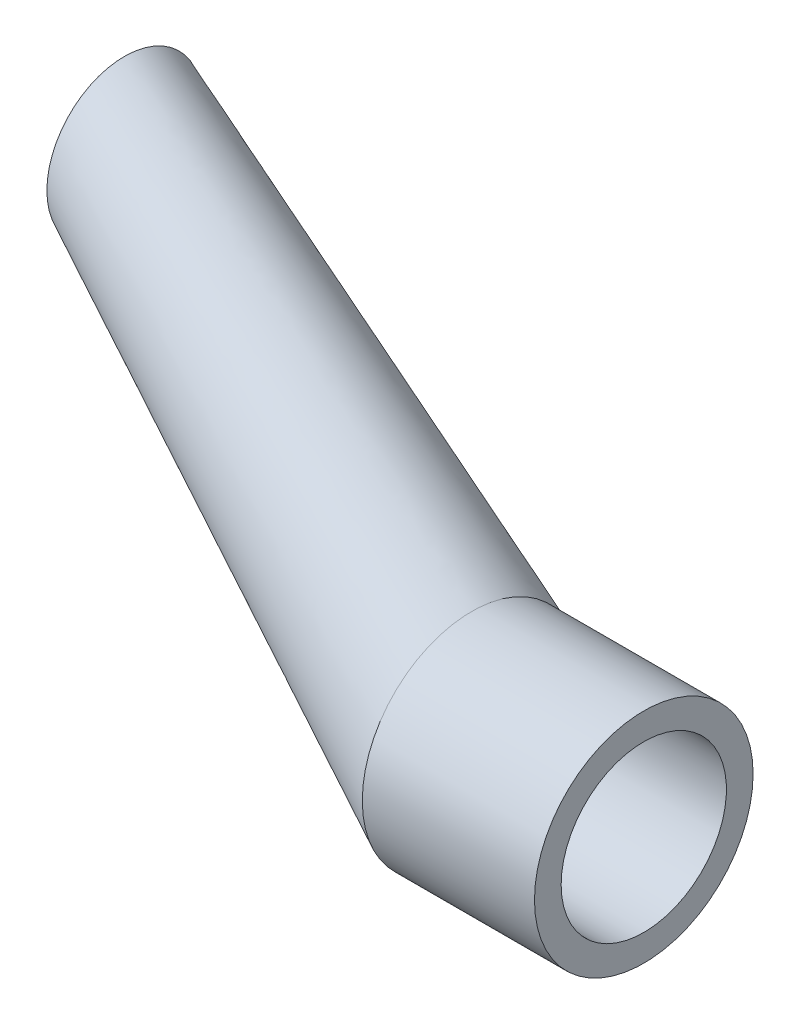
ISO-10303-21;
HEADER;
FILE_DESCRIPTION(('STEP AP214'),'2;1');
FILE_NAME('part.step','',(''),(''),'','','');
FILE_SCHEMA(('AUTOMOTIVE_DESIGN { 1 0 10303 214 1 1 1 1 }'));
ENDSEC;
DATA;
#1=APPLICATION_CONTEXT('core data for automotive mechanical design processes');
#2=APPLICATION_PROTOCOL_DEFINITION('international standard','automotive_design',2000,#1);
#3=PRODUCT_CONTEXT('',#1,'mechanical');
#4=PRODUCT('Part','Part','',(#3));
#5=PRODUCT_RELATED_PRODUCT_CATEGORY('part','',(#4));
#6=PRODUCT_DEFINITION_FORMATION('','',#4);
#7=PRODUCT_DEFINITION_CONTEXT('part definition',#1,'design');
#8=PRODUCT_DEFINITION('design','',#6,#7);
#9=PRODUCT_DEFINITION_SHAPE('','',#8);
#10=(LENGTH_UNIT() NAMED_UNIT(*) SI_UNIT(.MILLI.,.METRE.));
#11=(NAMED_UNIT(*) PLANE_ANGLE_UNIT() SI_UNIT($,.RADIAN.));
#12=(NAMED_UNIT(*) SI_UNIT($,.STERADIAN.) SOLID_ANGLE_UNIT());
#13=UNCERTAINTY_MEASURE_WITH_UNIT(LENGTH_MEASURE(1.E-05),#10,'distance_accuracy_value','');
#14=(GEOMETRIC_REPRESENTATION_CONTEXT(3) GLOBAL_UNCERTAINTY_ASSIGNED_CONTEXT((#13)) GLOBAL_UNIT_ASSIGNED_CONTEXT((#10,
#11,#12)) REPRESENTATION_CONTEXT('',''));
#15=CARTESIAN_POINT('',(0.,0.,0.));
#16=DIRECTION('',(0.,0.,1.));
#17=DIRECTION('',(1.,0.,0.));
#18=AXIS2_PLACEMENT_3D('',#15,#16,#17);
#19=CARTESIAN_POINT('',(66.,6.854756208915,13.901881790475));
#20=DIRECTION('',(1.,0.,0.));
#21=DIRECTION('',(0.,0.,1.));
#22=AXIS2_PLACEMENT_3D('',#19,#20,#21);
#23=CYLINDRICAL_SURFACE('',#22,2.4);
#24=CARTESIAN_POINT('',(66.,6.854756208915,16.301881790475));
#25=CARTESIAN_POINT('',(71.,6.854756208915,16.301881790475));
#26=(BOUNDED_CURVE() B_SPLINE_CURVE(1,(#24,#25),.UNSPECIFIED.,.F.,
.F.) B_SPLINE_CURVE_WITH_KNOTS((2,2),(0.,1.),
.UNSPECIFIED.) CURVE() GEOMETRIC_REPRESENTATION_ITEM() RATIONAL_B_SPLINE_CURVE((1.,1.)) REPRESENTATION_ITEM(''));
#27=CARTESIAN_POINT('',(66.,6.854756208915,16.301881790475));
#28=VERTEX_POINT('',#27);
#29=CARTESIAN_POINT('',(71.,6.854756208915,16.301881790475));
#30=VERTEX_POINT('',#29);
#31=EDGE_CURVE('E11',#28,#30,#26,.T.);
#32=ORIENTED_EDGE('',*,*,#31,.T.);
#33=CARTESIAN_POINT('',(71.,6.854756208915,13.901881790475));
#34=DIRECTION('',(1.,0.,0.));
#35=DIRECTION('',(0.,0.,1.));
#36=AXIS2_PLACEMENT_3D('',#33,#34,#35);
#37=CIRCLE('',#36,2.4);
#38=EDGE_CURVE('E30',#30,#30,#37,.T.);
#39=ORIENTED_EDGE('',*,*,#38,.T.);
#40=ORIENTED_EDGE('',*,*,#31,.F.);
#41=CARTESIAN_POINT('',(66.,6.854756208915,13.901881790475));
#42=DIRECTION('',(1.,0.,0.));
#43=DIRECTION('',(0.,0.,1.));
#44=AXIS2_PLACEMENT_3D('',#41,#42,#43);
#45=CIRCLE('',#44,2.4);
#46=EDGE_CURVE('E92',#28,#28,#45,.T.);
#47=ORIENTED_EDGE('',*,*,#46,.F.);
#48=EDGE_LOOP('',(#32,#39,#40,#47));
#49=FACE_BOUND('',#48,.T.);
#50=ADVANCED_FACE('F17',(#49),#23,.F.);
#51=CARTESIAN_POINT('',(71.,6.854756208915,13.901881790475));
#52=DIRECTION('',(1.,0.,0.));
#53=DIRECTION('',(0.,1.,0.));
#54=AXIS2_PLACEMENT_3D('',#51,#52,#53);
#55=PLANE('',#54);
#56=ORIENTED_EDGE('',*,*,#38,.F.);
#57=EDGE_LOOP('',(#56));
#58=FACE_BOUND('',#57,.T.);
#59=CARTESIAN_POINT('',(71.,6.854756208915,13.901881790475));
#60=DIRECTION('',(1.,0.,0.));
#61=DIRECTION('',(0.,0.,1.));
#62=AXIS2_PLACEMENT_3D('',#59,#60,#61);
#63=CIRCLE('',#62,3.175);
#64=CARTESIAN_POINT('',(71.,6.854756208915,17.076881790475));
#65=VERTEX_POINT('',#64);
#66=EDGE_CURVE('E93',#65,#65,#63,.T.);
#67=ORIENTED_EDGE('',*,*,#66,.T.);
#68=EDGE_LOOP('',(#67));
#69=FACE_BOUND('',#68,.T.);
#70=ADVANCED_FACE('F116',(#58,#69),#55,.T.);
#71=CARTESIAN_POINT('',(49.7,10.483647422994,9.337206040581));
#72=CARTESIAN_POINT('',(66.,6.854756208915,16.301881790475));
#73=CARTESIAN_POINT('',(49.699999999994,9.68616621093,9.337206040581));
#74=CARTESIAN_POINT('',(65.999999999991,5.69478353682,16.301881790474));
#75=CARTESIAN_POINT('',(49.700000000024,8.888684679958,8.919643563108));
#76=CARTESIAN_POINT('',(66.000000000039,4.534810400868,15.694518186883));
#77=CARTESIAN_POINT('',(49.699999999937,8.329716634219,8.084543467617));
#78=CARTESIAN_POINT('',(65.999999999895,3.721765970679,14.479827138878));
#79=CARTESIAN_POINT('',(49.70000000012,8.24774629211,6.981631093614));
#80=CARTESIAN_POINT('',(66.000000000207,3.602536382208,12.87559095855));
#81=CARTESIAN_POINT('',(49.699999999832,8.776774108059,5.911110990331));
#82=CARTESIAN_POINT('',(65.999999999691,4.372031387137,11.318470808253));
#83=CARTESIAN_POINT('',(49.700000000177,9.841058763432,5.239101074214));
#84=CARTESIAN_POINT('',(66.000000000358,5.920081795076,10.341001839447));
#85=CARTESIAN_POINT('',(49.699999999857,11.126236082565,5.239101074211));
#86=CARTESIAN_POINT('',(65.99999999967,7.789430622759,10.341001839341));
#87=CARTESIAN_POINT('',(49.700000000087,12.190520737913,5.911110990334));
#88=CARTESIAN_POINT('',(66.000000000244,9.337481030681,11.318470808338));
#89=CARTESIAN_POINT('',(49.69999999996,12.719548553896,6.981631093612));
#90=CARTESIAN_POINT('',(65.999999999855,10.106976035634,12.875590958496));
#91=CARTESIAN_POINT('',(49.700000000014,12.637578211759,8.084543467617));
#92=CARTESIAN_POINT('',(66.000000000067,9.987746447143,14.479827138904));
#93=CARTESIAN_POINT('',(49.699999999997,12.078610166035,8.919643563108));
#94=CARTESIAN_POINT('',(65.999999999977,9.174702016965,15.694518186874));
#95=CARTESIAN_POINT('',(49.7,11.281128635058,9.337206040581));
#96=CARTESIAN_POINT('',(66.000000000005,8.014728881009,16.301881790476));
#97=CARTESIAN_POINT('',(49.7,10.483647422994,9.337206040581));
#98=CARTESIAN_POINT('',(66.,6.854756208915,16.301881790475));
#99=(BOUNDED_SURFACE() B_SPLINE_SURFACE(13,1,((#71,#72),(#73,#74),(#75,#76),(#77,#78),(#79,#80),
(#81,#82),(#83,#84),(#85,#86),(#87,#88),(#89,#90),(#91,#92),(#93,#94),(#95,#96),(#97,#98)),
.UNSPECIFIED.,.T.,.F.,.F.) B_SPLINE_SURFACE_WITH_KNOTS((14,14),(2,2),(0.,6.28318530718),(0.,1.),
.UNSPECIFIED.) GEOMETRIC_REPRESENTATION_ITEM() RATIONAL_B_SPLINE_SURFACE(((1.,1.),(1.,1.),(1.,
1.),(1.,1.),(1.,1.),(1.,1.),(1.,1.),(1.,1.),(1.,1.),(1.,1.),(1.,1.),(1.,1.),(1.,1.),(1.,1.))) REPRESENTATION_ITEM('') SURFACE());
#100=CARTESIAN_POINT('',(49.7,10.483647422994,9.337206040581));
#101=CARTESIAN_POINT('',(66.,6.854756208915,16.301881790475));
#102=(BOUNDED_CURVE() B_SPLINE_CURVE(1,(#100,#101),.UNSPECIFIED.,.F.,
.F.) B_SPLINE_CURVE_WITH_KNOTS((2,2),(0.,1.),
.UNSPECIFIED.) CURVE() GEOMETRIC_REPRESENTATION_ITEM() RATIONAL_B_SPLINE_CURVE((1.,1.)) REPRESENTATION_ITEM(''));
#103=CARTESIAN_POINT('',(49.7,10.483647422994,9.337206040581));
#104=VERTEX_POINT('',#103);
#105=EDGE_CURVE('E85',#104,#28,#102,.T.);
#106=CARTESIAN_POINT('',(49.7,10.483647422994,7.687206040581));
#107=DIRECTION('',(1.,0.,0.));
#108=DIRECTION('',(0.,0.,1.));
#109=AXIS2_PLACEMENT_3D('',#106,#107,#108);
#110=CIRCLE('',#109,1.65);
#111=EDGE_CURVE('E23',#104,#104,#110,.T.);
#112=ORIENTED_EDGE('',*,*,#105,.T.);
#113=ORIENTED_EDGE('',*,*,#46,.T.);
#114=ORIENTED_EDGE('',*,*,#105,.F.);
#115=ORIENTED_EDGE('',*,*,#111,.F.);
#116=EDGE_LOOP('',(#112,#113,#114,#115));
#117=FACE_BOUND('',#116,.T.);
#118=ADVANCED_FACE('F118',(#117),#99,.F.);
#119=CARTESIAN_POINT('',(66.,6.854756208915,13.901881790475));
#120=DIRECTION('',(1.,0.,0.));
#121=DIRECTION('',(0.,0.,1.));
#122=AXIS2_PLACEMENT_3D('',#119,#120,#121);
#123=CYLINDRICAL_SURFACE('',#122,3.175);
#124=CARTESIAN_POINT('',(66.,6.854756208915,13.901881790475));
#125=DIRECTION('',(1.,0.,0.));
#126=DIRECTION('',(0.,0.,1.));
#127=AXIS2_PLACEMENT_3D('',#124,#125,#126);
#128=CIRCLE('',#127,3.175);
#129=CARTESIAN_POINT('',(66.,6.854756208915,17.076881790475));
#130=VERTEX_POINT('',#129);
#131=EDGE_CURVE('E71',#130,#130,#128,.T.);
#132=ORIENTED_EDGE('',*,*,#131,.T.);
#133=CARTESIAN_POINT('',(66.,6.854756208915,17.076881790475));
#134=CARTESIAN_POINT('',(71.,6.854756208915,17.076881790475));
#135=(BOUNDED_CURVE() B_SPLINE_CURVE(1,(#133,#134),.UNSPECIFIED.,.F.,
.F.) B_SPLINE_CURVE_WITH_KNOTS((2,2),(0.,1.),
.UNSPECIFIED.) CURVE() GEOMETRIC_REPRESENTATION_ITEM() RATIONAL_B_SPLINE_CURVE((1.,1.)) REPRESENTATION_ITEM(''));
#136=EDGE_CURVE('E59',#130,#65,#135,.T.);
#137=ORIENTED_EDGE('',*,*,#136,.T.);
#138=ORIENTED_EDGE('',*,*,#66,.F.);
#139=ORIENTED_EDGE('',*,*,#136,.F.);
#140=EDGE_LOOP('',(#132,#137,#138,#139));
#141=FACE_BOUND('',#140,.T.);
#142=ADVANCED_FACE('F124',(#141),#123,.T.);
#143=CARTESIAN_POINT('',(49.7,10.483647422994,7.687206040581));
#144=DIRECTION('',(1.,0.,0.));
#145=DIRECTION('',(0.,1.,0.));
#146=AXIS2_PLACEMENT_3D('',#143,#144,#145);
#147=PLANE('',#146);
#148=ORIENTED_EDGE('',*,*,#111,.T.);
#149=EDGE_LOOP('',(#148));
#150=FACE_BOUND('',#149,.T.);
#151=CARTESIAN_POINT('',(49.7,10.483647422994,7.687206040581));
#152=DIRECTION('',(1.,0.,0.));
#153=DIRECTION('',(0.,0.,1.));
#154=AXIS2_PLACEMENT_3D('',#151,#152,#153);
#155=CIRCLE('',#154,2.25);
#156=CARTESIAN_POINT('',(49.7,10.483647422994,9.937206040581));
#157=VERTEX_POINT('',#156);
#158=EDGE_CURVE('E70',#157,#157,#155,.T.);
#159=ORIENTED_EDGE('',*,*,#158,.F.);
#160=EDGE_LOOP('',(#159));
#161=FACE_BOUND('',#160,.T.);
#162=ADVANCED_FACE('F128',(#150,#161),#147,.F.);
#163=CARTESIAN_POINT('',(49.7,10.483647422994,9.937206040581));
#164=CARTESIAN_POINT('',(66.,6.854756208915,17.076881790475));
#165=CARTESIAN_POINT('',(49.699999999994,9.396173042906,9.937206040581));
#166=CARTESIAN_POINT('',(65.999999999991,5.320209028123,17.076881790474));
#167=CARTESIAN_POINT('',(49.700000000024,8.308698227949,9.367802662208));
#168=CARTESIAN_POINT('',(66.000000000039,3.785661233687,16.273390356551));
#169=CARTESIAN_POINT('',(49.699999999937,7.546469074653,8.229029804721));
#170=CARTESIAN_POINT('',(65.999999999895,2.710071206249,14.666455324313));
#171=CARTESIAN_POINT('',(49.70000000012,7.434691335449,6.725058385624));
#172=CARTESIAN_POINT('',(66.000000000207,2.552340396501,12.544184544046));
#173=CARTESIAN_POINT('',(49.699999999832,8.156092902589,5.265258244789));
#174=CARTESIAN_POINT('',(65.999999999691,3.570318163437,10.484244345285));
#175=CARTESIAN_POINT('',(49.700000000177,9.607390160006,4.348881086441));
#176=CARTESIAN_POINT('',(66.000000000358,5.618259848942,9.191134355211));
#177=CARTESIAN_POINT('',(49.699999999857,11.359904685988,4.348881086444));
#178=CARTESIAN_POINT('',(65.99999999967,8.091252568894,9.19113435517));
#179=CARTESIAN_POINT('',(49.700000000087,12.811201943389,5.265258244785));
#180=CARTESIAN_POINT('',(66.000000000244,10.139194254379,10.484244345317));
#181=CARTESIAN_POINT('',(49.69999999996,13.532603510551,6.725058385628));
#182=CARTESIAN_POINT('',(65.999999999855,11.157172021344,12.544184544028));
#183=CARTESIAN_POINT('',(49.700000000014,13.42082577133,8.229029804719));
#184=CARTESIAN_POINT('',(66.000000000067,10.999441211571,14.666455324321));
#185=CARTESIAN_POINT('',(49.699999999997,12.658596618042,9.367802662209));
#186=CARTESIAN_POINT('',(65.999999999977,9.923851184147,16.273390356548));
#187=CARTESIAN_POINT('',(49.7,11.571121803082,9.93720604058));
#188=CARTESIAN_POINT('',(66.000000000005,8.389303389706,17.076881790475));
#189=CARTESIAN_POINT('',(49.7,10.483647422994,9.937206040581));
#190=CARTESIAN_POINT('',(66.,6.854756208915,17.076881790475));
#191=(BOUNDED_SURFACE() B_SPLINE_SURFACE(13,1,((#163,#164),(#165,#166),(#167,#168),(#169,#170),
(#171,#172),(#173,#174),(#175,#176),(#177,#178),(#179,#180),(#181,#182),(#183,#184),(#185,#186),
(#187,#188),(#189,#190)),.UNSPECIFIED.,.T.,.F.,.F.) B_SPLINE_SURFACE_WITH_KNOTS((14,14),(2,2),
(0.,6.28318530718),(0.,1.),
.UNSPECIFIED.) GEOMETRIC_REPRESENTATION_ITEM() RATIONAL_B_SPLINE_SURFACE(((1.,1.),(1.,1.),(1.,
1.),(1.,1.),(1.,1.),(1.,1.),(1.,1.),(1.,1.),(1.,1.),(1.,1.),(1.,1.),(1.,1.),(1.,1.),(1.,1.))) REPRESENTATION_ITEM('') SURFACE());
#192=CARTESIAN_POINT('',(49.7,10.483647422994,9.937206040581));
#193=CARTESIAN_POINT('',(66.,6.854756208915,17.076881790475));
#194=(BOUNDED_CURVE() B_SPLINE_CURVE(1,(#192,#193),.UNSPECIFIED.,.F.,
.F.) B_SPLINE_CURVE_WITH_KNOTS((2,2),(0.,1.),
.UNSPECIFIED.) CURVE() GEOMETRIC_REPRESENTATION_ITEM() RATIONAL_B_SPLINE_CURVE((1.,1.)) REPRESENTATION_ITEM(''));
#195=EDGE_CURVE('E68',#157,#130,#194,.T.);
#196=ORIENTED_EDGE('',*,*,#158,.T.);
#197=ORIENTED_EDGE('',*,*,#195,.T.);
#198=ORIENTED_EDGE('',*,*,#131,.F.);
#199=ORIENTED_EDGE('',*,*,#195,.F.);
#200=EDGE_LOOP('',(#196,#197,#198,#199));
#201=FACE_BOUND('',#200,.T.);
#202=ADVANCED_FACE('F19',(#201),#191,.T.);
#203=CLOSED_SHELL('',(#50,#70,#118,#142,#162,#202));
#204=MANIFOLD_SOLID_BREP('B1',#203);
#205=ADVANCED_BREP_SHAPE_REPRESENTATION('',(#18,#204),#14);
#206=SHAPE_DEFINITION_REPRESENTATION(#9,#205);
ENDSEC;
END-ISO-10303-21;
